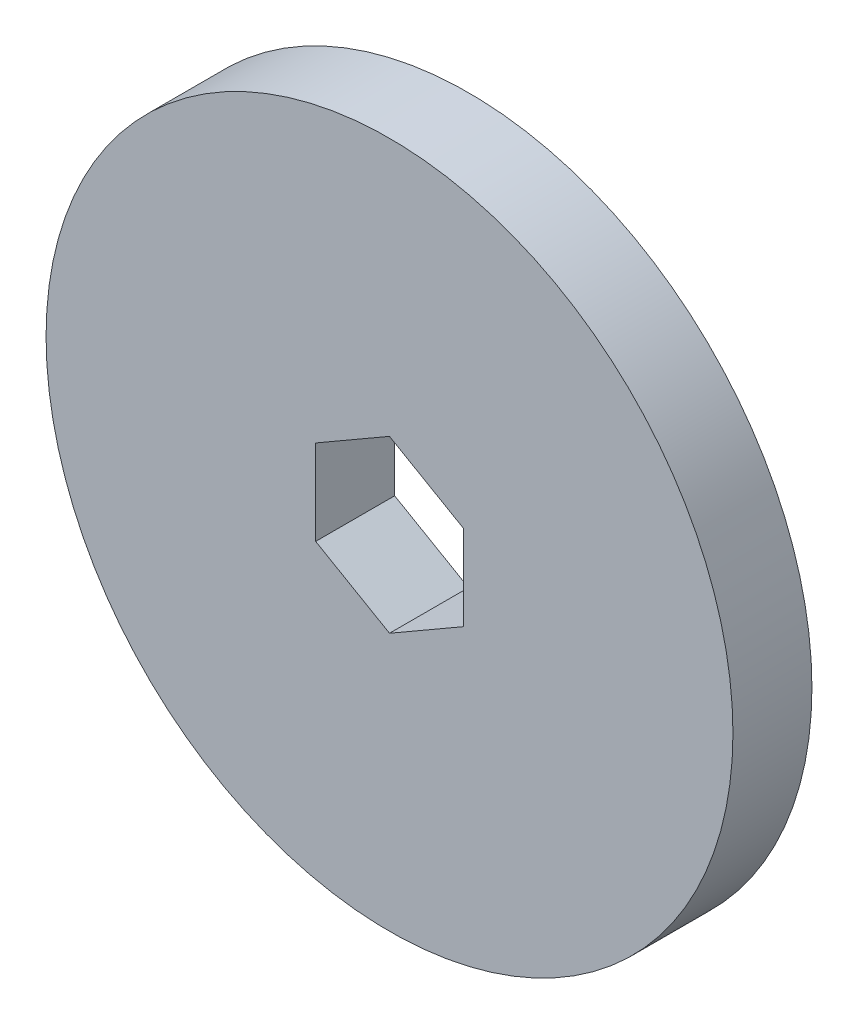
ISO-10303-21;
HEADER;
FILE_DESCRIPTION(('STEP AP214'),'2;1');
FILE_NAME('part.step','',(''),(''),'','','');
FILE_SCHEMA(('AUTOMOTIVE_DESIGN { 1 0 10303 214 1 1 1 1 }'));
ENDSEC;
DATA;
#1=APPLICATION_CONTEXT('core data for automotive mechanical design processes');
#2=APPLICATION_PROTOCOL_DEFINITION('international standard','automotive_design',2000,#1);
#3=PRODUCT_CONTEXT('',#1,'mechanical');
#4=PRODUCT('Part','Part','',(#3));
#5=PRODUCT_RELATED_PRODUCT_CATEGORY('part','',(#4));
#6=PRODUCT_DEFINITION_FORMATION('','',#4);
#7=PRODUCT_DEFINITION_CONTEXT('part definition',#1,'design');
#8=PRODUCT_DEFINITION('design','',#6,#7);
#9=PRODUCT_DEFINITION_SHAPE('','',#8);
#10=(LENGTH_UNIT() NAMED_UNIT(*) SI_UNIT(.MILLI.,.METRE.));
#11=(NAMED_UNIT(*) PLANE_ANGLE_UNIT() SI_UNIT($,.RADIAN.));
#12=(NAMED_UNIT(*) SI_UNIT($,.STERADIAN.) SOLID_ANGLE_UNIT());
#13=UNCERTAINTY_MEASURE_WITH_UNIT(LENGTH_MEASURE(1.E-05),#10,'distance_accuracy_value','');
#14=(GEOMETRIC_REPRESENTATION_CONTEXT(3) GLOBAL_UNCERTAINTY_ASSIGNED_CONTEXT((#13)) GLOBAL_UNIT_ASSIGNED_CONTEXT((#10,
#11,#12)) REPRESENTATION_CONTEXT('',''));
#15=CARTESIAN_POINT('',(0.,0.,0.));
#16=DIRECTION('',(0.,0.,1.));
#17=DIRECTION('',(1.,0.,0.));
#18=AXIS2_PLACEMENT_3D('',#15,#16,#17);
#19=CARTESIAN_POINT('',(0.,0.,5.842));
#20=DIRECTION('',(0.,0.,1.));
#21=DIRECTION('',(1.,0.,0.));
#22=AXIS2_PLACEMENT_3D('',#19,#20,#21);
#23=PLANE('',#22);
#24=CARTESIAN_POINT('',(0.,0.,5.842));
#25=DIRECTION('',(0.,0.,1.));
#26=DIRECTION('',(1.,0.,0.));
#27=AXIS2_PLACEMENT_3D('',#24,#25,#26);
#28=CIRCLE('',#27,25.4);
#29=CARTESIAN_POINT('',(25.4,0.,5.842));
#30=VERTEX_POINT('',#29);
#31=EDGE_CURVE('E11',#30,#30,#28,.T.);
#32=ORIENTED_EDGE('',*,*,#31,.T.);
#33=EDGE_LOOP('',(#32));
#34=FACE_BOUND('',#33,.T.);
#35=DIRECTION('',(0.866025403784439,0.499999999999999,0.));
#36=VECTOR('',#35,1.);
#37=CARTESIAN_POINT('',(0.,-6.30581964008909,5.842));
#38=LINE('',#37,#36);
#39=CARTESIAN_POINT('',(0.,-6.30581964008909,5.842));
#40=VERTEX_POINT('',#39);
#41=CARTESIAN_POINT('',(5.461,-3.15290982004455,5.842));
#42=VERTEX_POINT('',#41);
#43=EDGE_CURVE('E94',#40,#42,#38,.T.);
#44=ORIENTED_EDGE('',*,*,#43,.F.);
#45=DIRECTION('',(0.866025403784438,-0.5,0.));
#46=VECTOR('',#45,1.);
#47=CARTESIAN_POINT('',(-5.461,-3.15290982004454,5.842));
#48=LINE('',#47,#46);
#49=CARTESIAN_POINT('',(-5.461,-3.15290982004454,5.842));
#50=VERTEX_POINT('',#49);
#51=EDGE_CURVE('E86',#50,#40,#48,.T.);
#52=ORIENTED_EDGE('',*,*,#51,.F.);
#53=DIRECTION('',(0.,-1.,0.));
#54=VECTOR('',#53,1.);
#55=CARTESIAN_POINT('',(-5.461,3.15290982004455,5.842));
#56=LINE('',#55,#54);
#57=CARTESIAN_POINT('',(-5.461,3.15290982004455,5.842));
#58=VERTEX_POINT('',#57);
#59=EDGE_CURVE('E114',#58,#50,#56,.T.);
#60=ORIENTED_EDGE('',*,*,#59,.F.);
#61=DIRECTION('',(-0.866025403784439,-0.499999999999999,0.));
#62=VECTOR('',#61,1.);
#63=CARTESIAN_POINT('',(0.,6.30581964008909,5.842));
#64=LINE('',#63,#62);
#65=CARTESIAN_POINT('',(0.,6.30581964008909,5.842));
#66=VERTEX_POINT('',#65);
#67=EDGE_CURVE('E112',#66,#58,#64,.T.);
#68=ORIENTED_EDGE('',*,*,#67,.F.);
#69=DIRECTION('',(-0.866025403784439,0.5,0.));
#70=VECTOR('',#69,1.);
#71=CARTESIAN_POINT('',(5.461,3.15290982004454,5.842));
#72=LINE('',#71,#70);
#73=CARTESIAN_POINT('',(5.461,3.15290982004454,5.842));
#74=VERTEX_POINT('',#73);
#75=EDGE_CURVE('E108',#74,#66,#72,.T.);
#76=ORIENTED_EDGE('',*,*,#75,.F.);
#77=DIRECTION('',(0.,1.,0.));
#78=VECTOR('',#77,1.);
#79=CARTESIAN_POINT('',(5.461,-3.15290982004455,5.842));
#80=LINE('',#79,#78);
#81=EDGE_CURVE('E106',#42,#74,#80,.T.);
#82=ORIENTED_EDGE('',*,*,#81,.F.);
#83=EDGE_LOOP('',(#44,#52,#60,#68,#76,#82));
#84=FACE_BOUND('',#83,.T.);
#85=ADVANCED_FACE('F33',(#34,#84),#23,.T.);
#86=CARTESIAN_POINT('',(0.,0.,0.));
#87=DIRECTION('',(0.,0.,1.));
#88=DIRECTION('',(1.,0.,0.));
#89=AXIS2_PLACEMENT_3D('',#86,#87,#88);
#90=PLANE('',#89);
#91=CARTESIAN_POINT('',(0.,0.,0.));
#92=DIRECTION('',(0.,0.,1.));
#93=DIRECTION('',(1.,0.,0.));
#94=AXIS2_PLACEMENT_3D('',#91,#92,#93);
#95=CIRCLE('',#94,25.4);
#96=CARTESIAN_POINT('',(25.4,0.,0.));
#97=VERTEX_POINT('',#96);
#98=EDGE_CURVE('E37',#97,#97,#95,.T.);
#99=ORIENTED_EDGE('',*,*,#98,.F.);
#100=EDGE_LOOP('',(#99));
#101=FACE_BOUND('',#100,.T.);
#102=DIRECTION('',(0.866025403784438,-0.5,0.));
#103=VECTOR('',#102,1.);
#104=CARTESIAN_POINT('',(-5.461,-3.15290982004454,0.));
#105=LINE('',#104,#103);
#106=CARTESIAN_POINT('',(-5.461,-3.15290982004454,0.));
#107=VERTEX_POINT('',#106);
#108=CARTESIAN_POINT('',(0.,-6.30581964008909,0.));
#109=VERTEX_POINT('',#108);
#110=EDGE_CURVE('E56',#107,#109,#105,.T.);
#111=ORIENTED_EDGE('',*,*,#110,.T.);
#112=DIRECTION('',(0.866025403784439,0.499999999999999,0.));
#113=VECTOR('',#112,1.);
#114=CARTESIAN_POINT('',(0.,-6.30581964008909,0.));
#115=LINE('',#114,#113);
#116=CARTESIAN_POINT('',(5.461,-3.15290982004455,0.));
#117=VERTEX_POINT('',#116);
#118=EDGE_CURVE('E101',#109,#117,#115,.T.);
#119=ORIENTED_EDGE('',*,*,#118,.T.);
#120=DIRECTION('',(0.,1.,0.));
#121=VECTOR('',#120,1.);
#122=CARTESIAN_POINT('',(5.461,-3.15290982004455,0.));
#123=LINE('',#122,#121);
#124=CARTESIAN_POINT('',(5.461,3.15290982004454,0.));
#125=VERTEX_POINT('',#124);
#126=EDGE_CURVE('E118',#117,#125,#123,.T.);
#127=ORIENTED_EDGE('',*,*,#126,.T.);
#128=DIRECTION('',(-0.866025403784439,0.5,0.));
#129=VECTOR('',#128,1.);
#130=CARTESIAN_POINT('',(5.461,3.15290982004454,0.));
#131=LINE('',#130,#129);
#132=CARTESIAN_POINT('',(0.,6.30581964008909,0.));
#133=VERTEX_POINT('',#132);
#134=EDGE_CURVE('E121',#125,#133,#131,.T.);
#135=ORIENTED_EDGE('',*,*,#134,.T.);
#136=DIRECTION('',(-0.866025403784439,-0.499999999999999,0.));
#137=VECTOR('',#136,1.);
#138=CARTESIAN_POINT('',(0.,6.30581964008909,0.));
#139=LINE('',#138,#137);
#140=CARTESIAN_POINT('',(-5.461,3.15290982004455,0.));
#141=VERTEX_POINT('',#140);
#142=EDGE_CURVE('E124',#133,#141,#139,.T.);
#143=ORIENTED_EDGE('',*,*,#142,.T.);
#144=DIRECTION('',(0.,-1.,0.));
#145=VECTOR('',#144,1.);
#146=CARTESIAN_POINT('',(-5.461,3.15290982004455,0.));
#147=LINE('',#146,#145);
#148=EDGE_CURVE('E95',#141,#107,#147,.T.);
#149=ORIENTED_EDGE('',*,*,#148,.T.);
#150=EDGE_LOOP('',(#111,#119,#127,#135,#143,#149));
#151=FACE_BOUND('',#150,.T.);
#152=ADVANCED_FACE('F141',(#101,#151),#90,.F.);
#153=CARTESIAN_POINT('',(0.,0.,5.842));
#154=DIRECTION('',(0.,0.,-1.));
#155=DIRECTION('',(-1.,0.,0.));
#156=AXIS2_PLACEMENT_3D('',#153,#154,#155);
#157=CYLINDRICAL_SURFACE('',#156,25.4);
#158=ORIENTED_EDGE('',*,*,#31,.F.);
#159=EDGE_LOOP('',(#158));
#160=FACE_BOUND('',#159,.T.);
#161=ORIENTED_EDGE('',*,*,#98,.T.);
#162=EDGE_LOOP('',(#161));
#163=FACE_BOUND('',#162,.T.);
#164=ADVANCED_FACE('F35',(#160,#163),#157,.T.);
#165=CARTESIAN_POINT('',(-5.461,-3.15290982004454,5.842));
#166=DIRECTION('',(0.5,0.866025403784438,0.));
#167=DIRECTION('',(-0.866025403784438,0.5,0.));
#168=AXIS2_PLACEMENT_3D('',#165,#166,#167);
#169=PLANE('',#168);
#170=ORIENTED_EDGE('',*,*,#110,.F.);
#171=DIRECTION('',(0.,0.,-1.));
#172=VECTOR('',#171,1.);
#173=CARTESIAN_POINT('',(-5.461,-3.15290982004454,5.842));
#174=LINE('',#173,#172);
#175=EDGE_CURVE('E90',#50,#107,#174,.T.);
#176=ORIENTED_EDGE('',*,*,#175,.F.);
#177=ORIENTED_EDGE('',*,*,#51,.T.);
#178=DIRECTION('',(0.,0.,-1.));
#179=VECTOR('',#178,1.);
#180=CARTESIAN_POINT('',(0.,-6.30581964008909,5.842));
#181=LINE('',#180,#179);
#182=EDGE_CURVE('E89',#40,#109,#181,.T.);
#183=ORIENTED_EDGE('',*,*,#182,.T.);
#184=EDGE_LOOP('',(#170,#176,#177,#183));
#185=FACE_BOUND('',#184,.T.);
#186=ADVANCED_FACE('F88',(#185),#169,.T.);
#187=CARTESIAN_POINT('',(0.,-6.30581964008909,5.842));
#188=DIRECTION('',(-0.499999999999999,0.866025403784439,0.));
#189=DIRECTION('',(-0.866025403784439,-0.499999999999999,0.));
#190=AXIS2_PLACEMENT_3D('',#187,#188,#189);
#191=PLANE('',#190);
#192=ORIENTED_EDGE('',*,*,#118,.F.);
#193=ORIENTED_EDGE('',*,*,#182,.F.);
#194=ORIENTED_EDGE('',*,*,#43,.T.);
#195=DIRECTION('',(0.,0.,-1.));
#196=VECTOR('',#195,1.);
#197=CARTESIAN_POINT('',(5.461,-3.15290982004455,5.842));
#198=LINE('',#197,#196);
#199=EDGE_CURVE('E102',#42,#117,#198,.T.);
#200=ORIENTED_EDGE('',*,*,#199,.T.);
#201=EDGE_LOOP('',(#192,#193,#194,#200));
#202=FACE_BOUND('',#201,.T.);
#203=ADVANCED_FACE('F98',(#202),#191,.T.);
#204=CARTESIAN_POINT('',(5.461,-3.15290982004455,5.842));
#205=DIRECTION('',(-1.,0.,0.));
#206=DIRECTION('',(0.,-1.,0.));
#207=AXIS2_PLACEMENT_3D('',#204,#205,#206);
#208=PLANE('',#207);
#209=ORIENTED_EDGE('',*,*,#126,.F.);
#210=ORIENTED_EDGE('',*,*,#199,.F.);
#211=ORIENTED_EDGE('',*,*,#81,.T.);
#212=DIRECTION('',(0.,0.,-1.));
#213=VECTOR('',#212,1.);
#214=CARTESIAN_POINT('',(5.461,3.15290982004454,5.842));
#215=LINE('',#214,#213);
#216=EDGE_CURVE('E133',#74,#125,#215,.T.);
#217=ORIENTED_EDGE('',*,*,#216,.T.);
#218=EDGE_LOOP('',(#209,#210,#211,#217));
#219=FACE_BOUND('',#218,.T.);
#220=ADVANCED_FACE('F137',(#219),#208,.T.);
#221=CARTESIAN_POINT('',(5.461,3.15290982004454,5.842));
#222=DIRECTION('',(-0.5,-0.866025403784439,0.));
#223=DIRECTION('',(0.866025403784439,-0.5,0.));
#224=AXIS2_PLACEMENT_3D('',#221,#222,#223);
#225=PLANE('',#224);
#226=ORIENTED_EDGE('',*,*,#134,.F.);
#227=ORIENTED_EDGE('',*,*,#216,.F.);
#228=ORIENTED_EDGE('',*,*,#75,.T.);
#229=DIRECTION('',(0.,0.,-1.));
#230=VECTOR('',#229,1.);
#231=CARTESIAN_POINT('',(0.,6.30581964008909,5.842));
#232=LINE('',#231,#230);
#233=EDGE_CURVE('E131',#66,#133,#232,.T.);
#234=ORIENTED_EDGE('',*,*,#233,.T.);
#235=EDGE_LOOP('',(#226,#227,#228,#234));
#236=FACE_BOUND('',#235,.T.);
#237=ADVANCED_FACE('F149',(#236),#225,.T.);
#238=CARTESIAN_POINT('',(0.,6.30581964008909,5.842));
#239=DIRECTION('',(0.5,-0.866025403784439,0.));
#240=DIRECTION('',(0.866025403784439,0.5,0.));
#241=AXIS2_PLACEMENT_3D('',#238,#239,#240);
#242=PLANE('',#241);
#243=ORIENTED_EDGE('',*,*,#142,.F.);
#244=ORIENTED_EDGE('',*,*,#233,.F.);
#245=ORIENTED_EDGE('',*,*,#67,.T.);
#246=DIRECTION('',(0.,0.,-1.));
#247=VECTOR('',#246,1.);
#248=CARTESIAN_POINT('',(-5.461,3.15290982004455,5.842));
#249=LINE('',#248,#247);
#250=EDGE_CURVE('E48',#58,#141,#249,.T.);
#251=ORIENTED_EDGE('',*,*,#250,.T.);
#252=EDGE_LOOP('',(#243,#244,#245,#251));
#253=FACE_BOUND('',#252,.T.);
#254=ADVANCED_FACE('F147',(#253),#242,.T.);
#255=CARTESIAN_POINT('',(-5.461,3.15290982004455,5.842));
#256=DIRECTION('',(1.,0.,0.));
#257=DIRECTION('',(0.,1.,0.));
#258=AXIS2_PLACEMENT_3D('',#255,#256,#257);
#259=PLANE('',#258);
#260=ORIENTED_EDGE('',*,*,#148,.F.);
#261=ORIENTED_EDGE('',*,*,#250,.F.);
#262=ORIENTED_EDGE('',*,*,#59,.T.);
#263=ORIENTED_EDGE('',*,*,#175,.T.);
#264=EDGE_LOOP('',(#260,#261,#262,#263));
#265=FACE_BOUND('',#264,.T.);
#266=ADVANCED_FACE('F143',(#265),#259,.T.);
#267=CLOSED_SHELL('',(#85,#152,#164,#186,#203,#220,#237,#254,#266));
#268=MANIFOLD_SOLID_BREP('B2',#267);
#269=ADVANCED_BREP_SHAPE_REPRESENTATION('',(#18,#268),#14);
#270=SHAPE_DEFINITION_REPRESENTATION(#9,#269);
ENDSEC;
END-ISO-10303-21;
